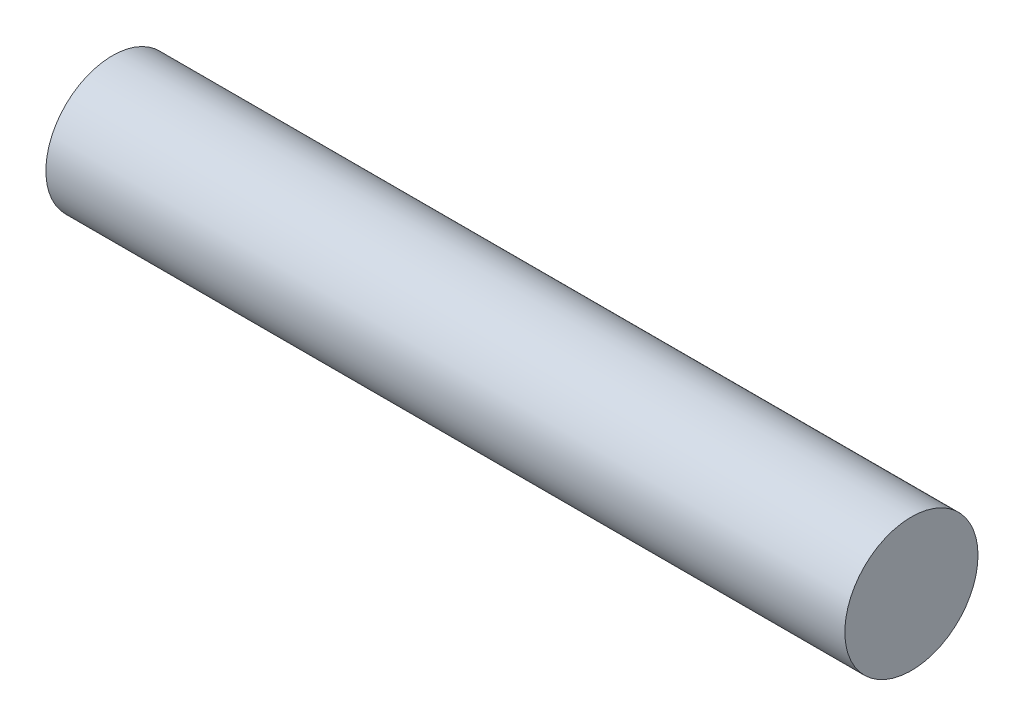
ISO-10303-21;
HEADER;
FILE_DESCRIPTION(('STEP AP214'),'2;1');
FILE_NAME('part.step','',(''),(''),'','','');
FILE_SCHEMA(('AUTOMOTIVE_DESIGN { 1 0 10303 214 1 1 1 1 }'));
ENDSEC;
DATA;
#1=APPLICATION_CONTEXT('core data for automotive mechanical design processes');
#2=APPLICATION_PROTOCOL_DEFINITION('international standard','automotive_design',2000,#1);
#3=PRODUCT_CONTEXT('',#1,'mechanical');
#4=PRODUCT('Part','Part','',(#3));
#5=PRODUCT_RELATED_PRODUCT_CATEGORY('part','',(#4));
#6=PRODUCT_DEFINITION_FORMATION('','',#4);
#7=PRODUCT_DEFINITION_CONTEXT('part definition',#1,'design');
#8=PRODUCT_DEFINITION('design','',#6,#7);
#9=PRODUCT_DEFINITION_SHAPE('','',#8);
#10=(LENGTH_UNIT() NAMED_UNIT(*) SI_UNIT(.MILLI.,.METRE.));
#11=(NAMED_UNIT(*) PLANE_ANGLE_UNIT() SI_UNIT($,.RADIAN.));
#12=(NAMED_UNIT(*) SI_UNIT($,.STERADIAN.) SOLID_ANGLE_UNIT());
#13=UNCERTAINTY_MEASURE_WITH_UNIT(LENGTH_MEASURE(1.E-05),#10,'distance_accuracy_value','');
#14=(GEOMETRIC_REPRESENTATION_CONTEXT(3) GLOBAL_UNCERTAINTY_ASSIGNED_CONTEXT((#13)) GLOBAL_UNIT_ASSIGNED_CONTEXT((#10,
#11,#12)) REPRESENTATION_CONTEXT('',''));
#15=CARTESIAN_POINT('',(0.,0.,0.));
#16=DIRECTION('',(0.,0.,1.));
#17=DIRECTION('',(1.,0.,0.));
#18=AXIS2_PLACEMENT_3D('',#15,#16,#17);
#19=CARTESIAN_POINT('',(0.,0.,0.));
#20=DIRECTION('',(-1.,0.,0.));
#21=DIRECTION('',(0.,0.,1.));
#22=AXIS2_PLACEMENT_3D('',#19,#20,#21);
#23=PLANE('',#22);
#24=CARTESIAN_POINT('',(0.,0.,0.));
#25=DIRECTION('',(1.,0.,0.));
#26=DIRECTION('',(0.,0.,-1.));
#27=AXIS2_PLACEMENT_3D('',#24,#25,#26);
#28=CIRCLE('',#27,15.);
#29=CARTESIAN_POINT('',(0.,0.,-15.));
#30=VERTEX_POINT('',#29);
#31=EDGE_CURVE('E10',#30,#30,#28,.T.);
#32=ORIENTED_EDGE('',*,*,#31,.F.);
#33=EDGE_LOOP('',(#32));
#34=FACE_BOUND('',#33,.T.);
#35=ADVANCED_FACE('F31',(#34),#23,.T.);
#36=CARTESIAN_POINT('',(0.,0.,0.));
#37=DIRECTION('',(1.,0.,0.));
#38=DIRECTION('',(0.,0.,-1.));
#39=AXIS2_PLACEMENT_3D('',#36,#37,#38);
#40=CYLINDRICAL_SURFACE('',#39,15.);
#41=ORIENTED_EDGE('',*,*,#31,.T.);
#42=EDGE_LOOP('',(#41));
#43=FACE_BOUND('',#42,.T.);
#44=CARTESIAN_POINT('',(180.,0.,0.));
#45=DIRECTION('',(1.,0.,0.));
#46=DIRECTION('',(0.,0.,-1.));
#47=AXIS2_PLACEMENT_3D('',#44,#45,#46);
#48=CIRCLE('',#47,15.);
#49=CARTESIAN_POINT('',(180.,0.,-15.));
#50=VERTEX_POINT('',#49);
#51=EDGE_CURVE('E37',#50,#50,#48,.T.);
#52=ORIENTED_EDGE('',*,*,#51,.F.);
#53=EDGE_LOOP('',(#52));
#54=FACE_BOUND('',#53,.T.);
#55=ADVANCED_FACE('F45',(#43,#54),#40,.T.);
#56=CARTESIAN_POINT('',(180.,0.,0.));
#57=DIRECTION('',(1.,0.,0.));
#58=DIRECTION('',(0.,0.,-1.));
#59=AXIS2_PLACEMENT_3D('',#56,#57,#58);
#60=PLANE('',#59);
#61=ORIENTED_EDGE('',*,*,#51,.T.);
#62=EDGE_LOOP('',(#61));
#63=FACE_BOUND('',#62,.T.);
#64=ADVANCED_FACE('F43',(#63),#60,.T.);
#65=CLOSED_SHELL('',(#35,#55,#64));
#66=MANIFOLD_SOLID_BREP('B2',#65);
#67=ADVANCED_BREP_SHAPE_REPRESENTATION('',(#18,#66),#14);
#68=SHAPE_DEFINITION_REPRESENTATION(#9,#67);
ENDSEC;
END-ISO-10303-21;
